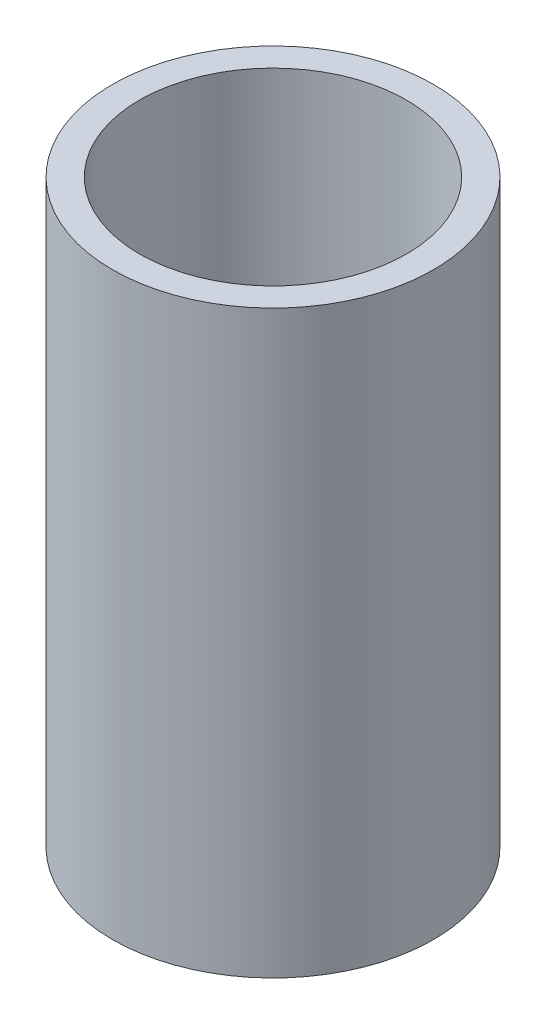
ISO-10303-21;
HEADER;
FILE_DESCRIPTION(('STEP AP214'),'2;1');
FILE_NAME('part.step','',(''),(''),'','','');
FILE_SCHEMA(('AUTOMOTIVE_DESIGN { 1 0 10303 214 1 1 1 1 }'));
ENDSEC;
DATA;
#1=APPLICATION_CONTEXT('core data for automotive mechanical design processes');
#2=APPLICATION_PROTOCOL_DEFINITION('international standard','automotive_design',2000,#1);
#3=PRODUCT_CONTEXT('',#1,'mechanical');
#4=PRODUCT('Part','Part','',(#3));
#5=PRODUCT_RELATED_PRODUCT_CATEGORY('part','',(#4));
#6=PRODUCT_DEFINITION_FORMATION('','',#4);
#7=PRODUCT_DEFINITION_CONTEXT('part definition',#1,'design');
#8=PRODUCT_DEFINITION('design','',#6,#7);
#9=PRODUCT_DEFINITION_SHAPE('','',#8);
#10=(LENGTH_UNIT() NAMED_UNIT(*) SI_UNIT(.MILLI.,.METRE.));
#11=(NAMED_UNIT(*) PLANE_ANGLE_UNIT() SI_UNIT($,.RADIAN.));
#12=(NAMED_UNIT(*) SI_UNIT($,.STERADIAN.) SOLID_ANGLE_UNIT());
#13=UNCERTAINTY_MEASURE_WITH_UNIT(LENGTH_MEASURE(1.E-05),#10,'distance_accuracy_value','');
#14=(GEOMETRIC_REPRESENTATION_CONTEXT(3) GLOBAL_UNCERTAINTY_ASSIGNED_CONTEXT((#13)) GLOBAL_UNIT_ASSIGNED_CONTEXT((#10,
#11,#12)) REPRESENTATION_CONTEXT('',''));
#15=CARTESIAN_POINT('',(0.,0.,0.));
#16=DIRECTION('',(0.,0.,1.));
#17=DIRECTION('',(1.,0.,0.));
#18=AXIS2_PLACEMENT_3D('',#15,#16,#17);
#19=CARTESIAN_POINT('',(0.,0.,0.));
#20=DIRECTION('',(0.,1.,0.));
#21=DIRECTION('',(0.,0.,1.));
#22=AXIS2_PLACEMENT_3D('',#19,#20,#21);
#23=CYLINDRICAL_SURFACE('',#22,17.526);
#24=CARTESIAN_POINT('',(0.,76.2,0.));
#25=DIRECTION('',(0.,1.,0.));
#26=DIRECTION('',(0.,0.,1.));
#27=AXIS2_PLACEMENT_3D('',#24,#25,#26);
#28=CIRCLE('',#27,17.526);
#29=CARTESIAN_POINT('',(0.,76.2,17.526));
#30=VERTEX_POINT('',#29);
#31=EDGE_CURVE('E26',#30,#30,#28,.F.);
#32=ORIENTED_EDGE('',*,*,#31,.F.);
#33=EDGE_LOOP('',(#32));
#34=FACE_BOUND('',#33,.T.);
#35=CARTESIAN_POINT('',(0.,0.,0.));
#36=DIRECTION('',(0.,1.,0.));
#37=DIRECTION('',(0.,0.,1.));
#38=AXIS2_PLACEMENT_3D('',#35,#36,#37);
#39=CIRCLE('',#38,17.526);
#40=CARTESIAN_POINT('',(0.,0.,17.526));
#41=VERTEX_POINT('',#40);
#42=EDGE_CURVE('E17',#41,#41,#39,.F.);
#43=ORIENTED_EDGE('',*,*,#42,.T.);
#44=EDGE_LOOP('',(#43));
#45=FACE_BOUND('',#44,.T.);
#46=ADVANCED_FACE('F14',(#34,#45),#23,.F.);
#47=CARTESIAN_POINT('',(0.,0.,0.));
#48=DIRECTION('',(0.,1.,0.));
#49=DIRECTION('',(0.,0.,1.));
#50=AXIS2_PLACEMENT_3D('',#47,#48,#49);
#51=PLANE('',#50);
#52=ORIENTED_EDGE('',*,*,#42,.F.);
#53=EDGE_LOOP('',(#52));
#54=FACE_BOUND('',#53,.T.);
#55=CARTESIAN_POINT('',(0.,0.,0.));
#56=DIRECTION('',(0.,1.,0.));
#57=DIRECTION('',(0.,0.,1.));
#58=AXIS2_PLACEMENT_3D('',#55,#56,#57);
#59=CIRCLE('',#58,21.082);
#60=CARTESIAN_POINT('',(0.,0.,21.082));
#61=VERTEX_POINT('',#60);
#62=EDGE_CURVE('E21',#61,#61,#59,.T.);
#63=ORIENTED_EDGE('',*,*,#62,.F.);
#64=EDGE_LOOP('',(#63));
#65=FACE_BOUND('',#64,.T.);
#66=ADVANCED_FACE('F35',(#54,#65),#51,.F.);
#67=CARTESIAN_POINT('',(0.,76.2,0.));
#68=DIRECTION('',(0.,1.,0.));
#69=DIRECTION('',(0.,0.,1.));
#70=AXIS2_PLACEMENT_3D('',#67,#68,#69);
#71=PLANE('',#70);
#72=ORIENTED_EDGE('',*,*,#31,.T.);
#73=EDGE_LOOP('',(#72));
#74=FACE_BOUND('',#73,.T.);
#75=CARTESIAN_POINT('',(0.,76.2,0.));
#76=DIRECTION('',(0.,1.,0.));
#77=DIRECTION('',(0.,0.,1.));
#78=AXIS2_PLACEMENT_3D('',#75,#76,#77);
#79=CIRCLE('',#78,21.082);
#80=CARTESIAN_POINT('',(0.,76.2,21.082));
#81=VERTEX_POINT('',#80);
#82=EDGE_CURVE('E10',#81,#81,#79,.F.);
#83=ORIENTED_EDGE('',*,*,#82,.F.);
#84=EDGE_LOOP('',(#83));
#85=FACE_BOUND('',#84,.T.);
#86=ADVANCED_FACE('F38',(#74,#85),#71,.T.);
#87=CARTESIAN_POINT('',(0.,0.,0.));
#88=DIRECTION('',(0.,1.,0.));
#89=DIRECTION('',(0.,0.,1.));
#90=AXIS2_PLACEMENT_3D('',#87,#88,#89);
#91=CYLINDRICAL_SURFACE('',#90,21.082);
#92=ORIENTED_EDGE('',*,*,#82,.T.);
#93=EDGE_LOOP('',(#92));
#94=FACE_BOUND('',#93,.T.);
#95=ORIENTED_EDGE('',*,*,#62,.T.);
#96=EDGE_LOOP('',(#95));
#97=FACE_BOUND('',#96,.T.);
#98=ADVANCED_FACE('F41',(#94,#97),#91,.T.);
#99=CLOSED_SHELL('',(#46,#66,#86,#98));
#100=MANIFOLD_SOLID_BREP('B1',#99);
#101=ADVANCED_BREP_SHAPE_REPRESENTATION('',(#18,#100),#14);
#102=SHAPE_DEFINITION_REPRESENTATION(#9,#101);
ENDSEC;
END-ISO-10303-21;
